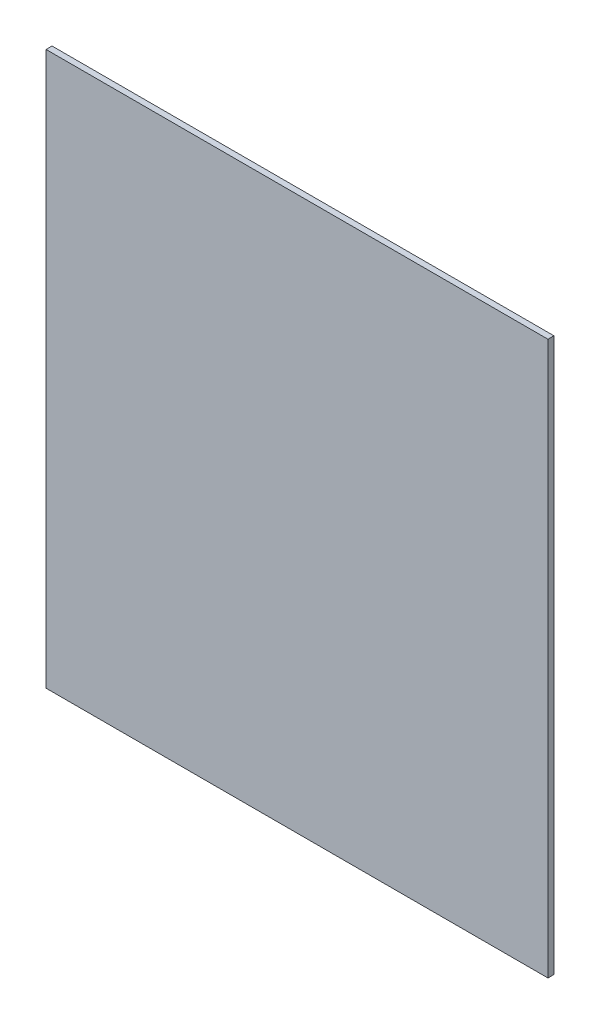
ISO-10303-21;
HEADER;
FILE_DESCRIPTION(('STEP AP214'),'2;1');
FILE_NAME('part.step','',(''),(''),'','','');
FILE_SCHEMA(('AUTOMOTIVE_DESIGN { 1 0 10303 214 1 1 1 1 }'));
ENDSEC;
DATA;
#1=APPLICATION_CONTEXT('core data for automotive mechanical design processes');
#2=APPLICATION_PROTOCOL_DEFINITION('international standard','automotive_design',2000,#1);
#3=PRODUCT_CONTEXT('',#1,'mechanical');
#4=PRODUCT('Part','Part','',(#3));
#5=PRODUCT_RELATED_PRODUCT_CATEGORY('part','',(#4));
#6=PRODUCT_DEFINITION_FORMATION('','',#4);
#7=PRODUCT_DEFINITION_CONTEXT('part definition',#1,'design');
#8=PRODUCT_DEFINITION('design','',#6,#7);
#9=PRODUCT_DEFINITION_SHAPE('','',#8);
#10=(LENGTH_UNIT() NAMED_UNIT(*) SI_UNIT(.MILLI.,.METRE.));
#11=(NAMED_UNIT(*) PLANE_ANGLE_UNIT() SI_UNIT($,.RADIAN.));
#12=(NAMED_UNIT(*) SI_UNIT($,.STERADIAN.) SOLID_ANGLE_UNIT());
#13=UNCERTAINTY_MEASURE_WITH_UNIT(LENGTH_MEASURE(1.E-05),#10,'distance_accuracy_value','');
#14=(GEOMETRIC_REPRESENTATION_CONTEXT(3) GLOBAL_UNCERTAINTY_ASSIGNED_CONTEXT((#13)) GLOBAL_UNIT_ASSIGNED_CONTEXT((#10,
#11,#12)) REPRESENTATION_CONTEXT('',''));
#15=CARTESIAN_POINT('',(0.,0.,0.));
#16=DIRECTION('',(0.,0.,1.));
#17=DIRECTION('',(1.,0.,0.));
#18=AXIS2_PLACEMENT_3D('',#15,#16,#17);
#19=CARTESIAN_POINT('',(36.89985,52.813458,0.36068));
#20=DIRECTION('',(0.,-1.,0.));
#21=DIRECTION('',(0.,0.,-1.));
#22=AXIS2_PLACEMENT_3D('',#19,#20,#21);
#23=PLANE('',#22);
#24=DIRECTION('',(0.,0.,1.));
#25=VECTOR('',#24,1.);
#26=CARTESIAN_POINT('',(33.699958,52.813458,0.32258));
#27=LINE('',#26,#25);
#28=CARTESIAN_POINT('',(33.699958,52.813458,0.32258));
#29=VERTEX_POINT('',#28);
#30=CARTESIAN_POINT('',(33.699958,52.813458,0.36068));
#31=VERTEX_POINT('',#30);
#32=EDGE_CURVE('E11',#29,#31,#27,.T.);
#33=ORIENTED_EDGE('',*,*,#32,.T.);
#34=DIRECTION('',(1.,0.,0.));
#35=VECTOR('',#34,1.);
#36=CARTESIAN_POINT('',(33.699958,52.813458,0.36068));
#37=LINE('',#36,#35);
#38=CARTESIAN_POINT('',(36.89985,52.813458,0.36068));
#39=VERTEX_POINT('',#38);
#40=EDGE_CURVE('E47',#31,#39,#37,.T.);
#41=ORIENTED_EDGE('',*,*,#40,.T.);
#42=DIRECTION('',(0.,0.,1.));
#43=VECTOR('',#42,1.);
#44=CARTESIAN_POINT('',(36.89985,52.813458,0.32258));
#45=LINE('',#44,#43);
#46=CARTESIAN_POINT('',(36.89985,52.813458,0.32258));
#47=VERTEX_POINT('',#46);
#48=EDGE_CURVE('E77',#47,#39,#45,.T.);
#49=ORIENTED_EDGE('',*,*,#48,.F.);
#50=DIRECTION('',(-1.,0.,0.));
#51=VECTOR('',#50,1.);
#52=CARTESIAN_POINT('',(36.89985,52.813458,0.32258));
#53=LINE('',#52,#51);
#54=EDGE_CURVE('E75',#47,#29,#53,.T.);
#55=ORIENTED_EDGE('',*,*,#54,.T.);
#56=EDGE_LOOP('',(#33,#41,#49,#55));
#57=FACE_BOUND('',#56,.T.);
#58=ADVANCED_FACE('F18',(#57),#23,.F.);
#59=CARTESIAN_POINT('',(33.699958,52.813458,0.36068));
#60=DIRECTION('',(1.,0.,0.));
#61=DIRECTION('',(0.,1.,0.));
#62=AXIS2_PLACEMENT_3D('',#59,#60,#61);
#63=PLANE('',#62);
#64=DIRECTION('',(0.,0.,-1.));
#65=VECTOR('',#64,1.);
#66=CARTESIAN_POINT('',(33.699958,49.286414,0.36068));
#67=LINE('',#66,#65);
#68=CARTESIAN_POINT('',(33.699958,49.286414,0.36068));
#69=VERTEX_POINT('',#68);
#70=CARTESIAN_POINT('',(33.699958,49.286414,0.32258));
#71=VERTEX_POINT('',#70);
#72=EDGE_CURVE('E91',#69,#71,#67,.T.);
#73=ORIENTED_EDGE('',*,*,#72,.F.);
#74=DIRECTION('',(0.,1.,0.));
#75=VECTOR('',#74,1.);
#76=CARTESIAN_POINT('',(33.699958,49.286414,0.36068));
#77=LINE('',#76,#75);
#78=EDGE_CURVE('E21',#69,#31,#77,.T.);
#79=ORIENTED_EDGE('',*,*,#78,.T.);
#80=ORIENTED_EDGE('',*,*,#32,.F.);
#81=DIRECTION('',(0.,-1.,0.));
#82=VECTOR('',#81,1.);
#83=CARTESIAN_POINT('',(33.699958,52.813458,0.32258));
#84=LINE('',#83,#82);
#85=EDGE_CURVE('E72',#29,#71,#84,.T.);
#86=ORIENTED_EDGE('',*,*,#85,.T.);
#87=EDGE_LOOP('',(#73,#79,#80,#86));
#88=FACE_BOUND('',#87,.T.);
#89=ADVANCED_FACE('F70',(#88),#63,.F.);
#90=CARTESIAN_POINT('',(0.,0.,0.36068));
#91=DIRECTION('',(0.,0.,1.));
#92=DIRECTION('',(1.,0.,0.));
#93=AXIS2_PLACEMENT_3D('',#90,#91,#92);
#94=PLANE('',#93);
#95=DIRECTION('',(0.,-1.,0.));
#96=VECTOR('',#95,1.);
#97=CARTESIAN_POINT('',(36.89985,52.813458,0.36068));
#98=LINE('',#97,#96);
#99=CARTESIAN_POINT('',(36.89985,49.286414,0.36068));
#100=VERTEX_POINT('',#99);
#101=EDGE_CURVE('E94',#39,#100,#98,.T.);
#102=ORIENTED_EDGE('',*,*,#101,.F.);
#103=ORIENTED_EDGE('',*,*,#40,.F.);
#104=ORIENTED_EDGE('',*,*,#78,.F.);
#105=DIRECTION('',(-1.,0.,0.));
#106=VECTOR('',#105,1.);
#107=CARTESIAN_POINT('',(36.89985,49.286414,0.36068));
#108=LINE('',#107,#106);
#109=EDGE_CURVE('E210',#100,#69,#108,.T.);
#110=ORIENTED_EDGE('',*,*,#109,.F.);
#111=EDGE_LOOP('',(#102,#103,#104,#110));
#112=FACE_BOUND('',#111,.T.);
#113=ADVANCED_FACE('F123',(#112),#94,.T.);
#114=CARTESIAN_POINT('',(36.89985,49.286414,0.36068));
#115=DIRECTION('',(-1.,0.,0.));
#116=DIRECTION('',(0.,0.,1.));
#117=AXIS2_PLACEMENT_3D('',#114,#115,#116);
#118=PLANE('',#117);
#119=ORIENTED_EDGE('',*,*,#48,.T.);
#120=ORIENTED_EDGE('',*,*,#101,.T.);
#121=DIRECTION('',(0.,0.,1.));
#122=VECTOR('',#121,1.);
#123=CARTESIAN_POINT('',(36.89985,49.286414,0.32258));
#124=LINE('',#123,#122);
#125=CARTESIAN_POINT('',(36.89985,49.286414,0.32258));
#126=VERTEX_POINT('',#125);
#127=EDGE_CURVE('E208',#126,#100,#124,.T.);
#128=ORIENTED_EDGE('',*,*,#127,.F.);
#129=DIRECTION('',(0.,1.,0.));
#130=VECTOR('',#129,1.);
#131=CARTESIAN_POINT('',(36.89985,49.286414,0.32258));
#132=LINE('',#131,#130);
#133=EDGE_CURVE('E81',#126,#47,#132,.T.);
#134=ORIENTED_EDGE('',*,*,#133,.T.);
#135=EDGE_LOOP('',(#119,#120,#128,#134));
#136=FACE_BOUND('',#135,.T.);
#137=ADVANCED_FACE('F128',(#136),#118,.F.);
#138=CARTESIAN_POINT('',(0.,0.,0.32258));
#139=DIRECTION('',(0.,0.,1.));
#140=DIRECTION('',(1.,0.,0.));
#141=AXIS2_PLACEMENT_3D('',#138,#139,#140);
#142=PLANE('',#141);
#143=ORIENTED_EDGE('',*,*,#85,.F.);
#144=ORIENTED_EDGE('',*,*,#54,.F.);
#145=ORIENTED_EDGE('',*,*,#133,.F.);
#146=DIRECTION('',(1.,0.,0.));
#147=VECTOR('',#146,1.);
#148=CARTESIAN_POINT('',(33.699958,49.286414,0.32258));
#149=LINE('',#148,#147);
#150=EDGE_CURVE('E85',#71,#126,#149,.T.);
#151=ORIENTED_EDGE('',*,*,#150,.F.);
#152=EDGE_LOOP('',(#143,#144,#145,#151));
#153=FACE_BOUND('',#152,.T.);
#154=ADVANCED_FACE('F83',(#153),#142,.F.);
#155=CARTESIAN_POINT('',(33.699958,49.286414,0.36068));
#156=DIRECTION('',(0.,1.,0.));
#157=DIRECTION('',(1.,0.,0.));
#158=AXIS2_PLACEMENT_3D('',#155,#156,#157);
#159=PLANE('',#158);
#160=ORIENTED_EDGE('',*,*,#127,.T.);
#161=ORIENTED_EDGE('',*,*,#109,.T.);
#162=ORIENTED_EDGE('',*,*,#72,.T.);
#163=ORIENTED_EDGE('',*,*,#150,.T.);
#164=EDGE_LOOP('',(#160,#161,#162,#163));
#165=FACE_BOUND('',#164,.T.);
#166=ADVANCED_FACE('F107',(#165),#159,.F.);
#167=CLOSED_SHELL('',(#58,#89,#113,#137,#154,#166));
#168=MANIFOLD_SOLID_BREP('B1',#167);
#169=ADVANCED_BREP_SHAPE_REPRESENTATION('',(#18,#168),#14);
#170=SHAPE_DEFINITION_REPRESENTATION(#9,#169);
ENDSEC;
END-ISO-10303-21;
